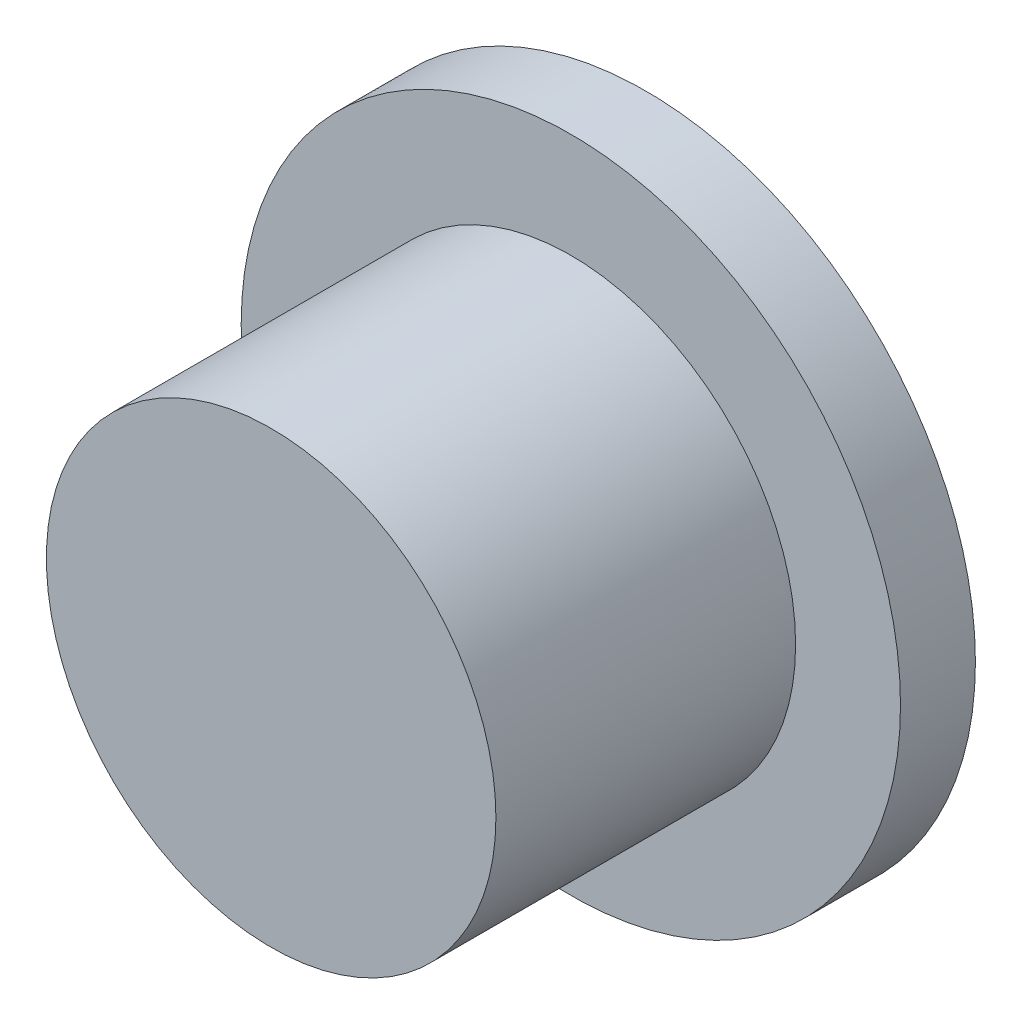
ISO-10303-21;
HEADER;
FILE_DESCRIPTION(('STEP AP214'),'2;1');
FILE_NAME('part.step','',(''),(''),'','','');
FILE_SCHEMA(('AUTOMOTIVE_DESIGN { 1 0 10303 214 1 1 1 1 }'));
ENDSEC;
DATA;
#1=APPLICATION_CONTEXT('core data for automotive mechanical design processes');
#2=APPLICATION_PROTOCOL_DEFINITION('international standard','automotive_design',2000,#1);
#3=PRODUCT_CONTEXT('',#1,'mechanical');
#4=PRODUCT('Part','Part','',(#3));
#5=PRODUCT_RELATED_PRODUCT_CATEGORY('part','',(#4));
#6=PRODUCT_DEFINITION_FORMATION('','',#4);
#7=PRODUCT_DEFINITION_CONTEXT('part definition',#1,'design');
#8=PRODUCT_DEFINITION('design','',#6,#7);
#9=PRODUCT_DEFINITION_SHAPE('','',#8);
#10=(LENGTH_UNIT() NAMED_UNIT(*) SI_UNIT(.MILLI.,.METRE.));
#11=(NAMED_UNIT(*) PLANE_ANGLE_UNIT() SI_UNIT($,.RADIAN.));
#12=(NAMED_UNIT(*) SI_UNIT($,.STERADIAN.) SOLID_ANGLE_UNIT());
#13=UNCERTAINTY_MEASURE_WITH_UNIT(LENGTH_MEASURE(1.E-05),#10,'distance_accuracy_value','');
#14=(GEOMETRIC_REPRESENTATION_CONTEXT(3) GLOBAL_UNCERTAINTY_ASSIGNED_CONTEXT((#13)) GLOBAL_UNIT_ASSIGNED_CONTEXT((#10,
#11,#12)) REPRESENTATION_CONTEXT('',''));
#15=CARTESIAN_POINT('',(0.,0.,0.));
#16=DIRECTION('',(0.,0.,1.));
#17=DIRECTION('',(1.,0.,0.));
#18=AXIS2_PLACEMENT_3D('',#15,#16,#17);
#19=CARTESIAN_POINT('',(0.,0.,20.));
#20=DIRECTION('',(0.,0.,-1.));
#21=DIRECTION('',(-1.,0.,0.));
#22=AXIS2_PLACEMENT_3D('',#19,#20,#21);
#23=CYLINDRICAL_SURFACE('',#22,15.);
#24=CARTESIAN_POINT('',(0.,0.,20.));
#25=DIRECTION('',(0.,0.,1.));
#26=DIRECTION('',(1.,0.,0.));
#27=AXIS2_PLACEMENT_3D('',#24,#25,#26);
#28=CIRCLE('',#27,15.);
#29=CARTESIAN_POINT('',(15.,0.,20.));
#30=VERTEX_POINT('',#29);
#31=EDGE_CURVE('E10',#30,#30,#28,.T.);
#32=ORIENTED_EDGE('',*,*,#31,.F.);
#33=EDGE_LOOP('',(#32));
#34=FACE_BOUND('',#33,.T.);
#35=CARTESIAN_POINT('',(0.,0.,0.));
#36=DIRECTION('',(0.,0.,1.));
#37=DIRECTION('',(1.,0.,0.));
#38=AXIS2_PLACEMENT_3D('',#35,#36,#37);
#39=CIRCLE('',#38,15.);
#40=CARTESIAN_POINT('',(15.,0.,0.));
#41=VERTEX_POINT('',#40);
#42=EDGE_CURVE('E38',#41,#41,#39,.T.);
#43=ORIENTED_EDGE('',*,*,#42,.T.);
#44=EDGE_LOOP('',(#43));
#45=FACE_BOUND('',#44,.T.);
#46=ADVANCED_FACE('F35',(#34,#45),#23,.T.);
#47=CARTESIAN_POINT('',(0.,0.,20.));
#48=DIRECTION('',(0.,0.,1.));
#49=DIRECTION('',(1.,0.,0.));
#50=AXIS2_PLACEMENT_3D('',#47,#48,#49);
#51=PLANE('',#50);
#52=ORIENTED_EDGE('',*,*,#31,.T.);
#53=EDGE_LOOP('',(#52));
#54=FACE_BOUND('',#53,.T.);
#55=ADVANCED_FACE('F58',(#54),#51,.T.);
#56=CARTESIAN_POINT('',(0.,0.,-5.));
#57=DIRECTION('',(0.,0.,1.));
#58=DIRECTION('',(1.,0.,0.));
#59=AXIS2_PLACEMENT_3D('',#56,#57,#58);
#60=CYLINDRICAL_SURFACE('',#59,22.);
#61=CARTESIAN_POINT('',(0.,0.,-5.));
#62=DIRECTION('',(0.,0.,-1.));
#63=DIRECTION('',(-1.,0.,0.));
#64=AXIS2_PLACEMENT_3D('',#61,#62,#63);
#65=CIRCLE('',#64,22.);
#66=CARTESIAN_POINT('',(-22.,0.,-5.));
#67=VERTEX_POINT('',#66);
#68=EDGE_CURVE('E45',#67,#67,#65,.T.);
#69=ORIENTED_EDGE('',*,*,#68,.F.);
#70=EDGE_LOOP('',(#69));
#71=FACE_BOUND('',#70,.T.);
#72=CARTESIAN_POINT('',(0.,0.,0.));
#73=DIRECTION('',(0.,0.,-1.));
#74=DIRECTION('',(-1.,0.,0.));
#75=AXIS2_PLACEMENT_3D('',#72,#73,#74);
#76=CIRCLE('',#75,22.);
#77=CARTESIAN_POINT('',(-22.,0.,0.));
#78=VERTEX_POINT('',#77);
#79=EDGE_CURVE('E47',#78,#78,#76,.T.);
#80=ORIENTED_EDGE('',*,*,#79,.T.);
#81=EDGE_LOOP('',(#80));
#82=FACE_BOUND('',#81,.T.);
#83=ADVANCED_FACE('F55',(#71,#82),#60,.T.);
#84=CARTESIAN_POINT('',(0.,0.,-5.));
#85=DIRECTION('',(0.,0.,-1.));
#86=DIRECTION('',(-1.,0.,0.));
#87=AXIS2_PLACEMENT_3D('',#84,#85,#86);
#88=PLANE('',#87);
#89=ORIENTED_EDGE('',*,*,#68,.T.);
#90=EDGE_LOOP('',(#89));
#91=FACE_BOUND('',#90,.T.);
#92=ADVANCED_FACE('F53',(#91),#88,.T.);
#93=CARTESIAN_POINT('',(0.,0.,0.));
#94=DIRECTION('',(0.,0.,-1.));
#95=DIRECTION('',(-1.,0.,0.));
#96=AXIS2_PLACEMENT_3D('',#93,#94,#95);
#97=PLANE('',#96);
#98=ORIENTED_EDGE('',*,*,#42,.F.);
#99=EDGE_LOOP('',(#98));
#100=FACE_BOUND('',#99,.T.);
#101=ORIENTED_EDGE('',*,*,#79,.F.);
#102=EDGE_LOOP('',(#101));
#103=FACE_BOUND('',#102,.T.);
#104=ADVANCED_FACE('F62',(#100,#103),#97,.F.);
#105=CLOSED_SHELL('',(#46,#55,#83,#92,#104));
#106=MANIFOLD_SOLID_BREP('B2',#105);
#107=ADVANCED_BREP_SHAPE_REPRESENTATION('',(#18,#106),#14);
#108=SHAPE_DEFINITION_REPRESENTATION(#9,#107);
ENDSEC;
END-ISO-10303-21;
